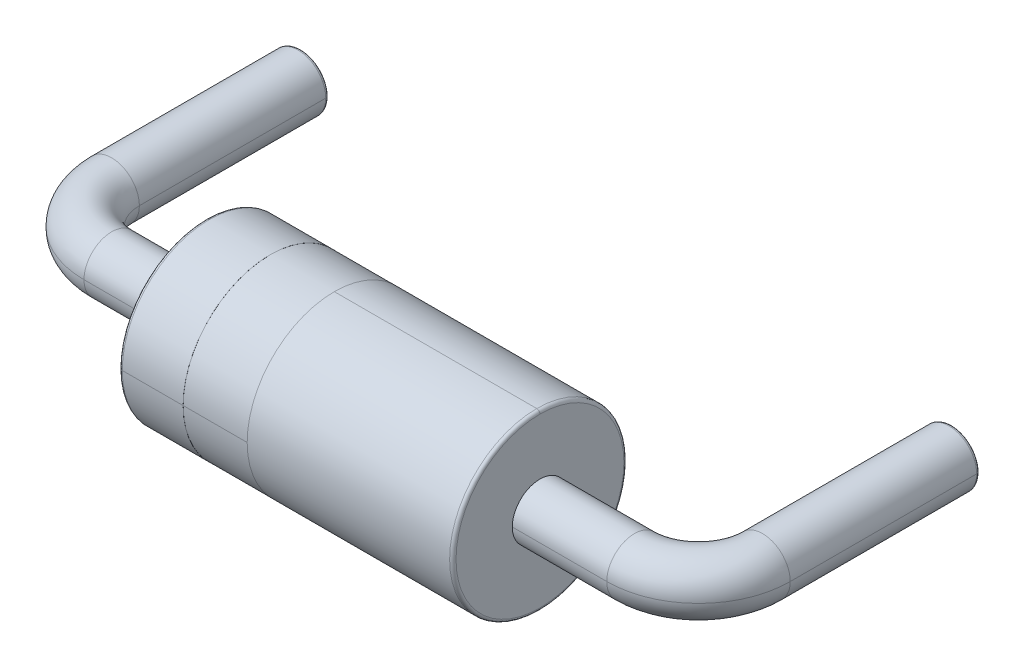
ISO-10303-21;
HEADER;
FILE_DESCRIPTION(('STEP AP214'),'2;1');
FILE_NAME('part.step','',(''),(''),'','','');
FILE_SCHEMA(('AUTOMOTIVE_DESIGN { 1 0 10303 214 1 1 1 1 }'));
ENDSEC;
DATA;
#1=APPLICATION_CONTEXT('core data for automotive mechanical design processes');
#2=APPLICATION_PROTOCOL_DEFINITION('international standard','automotive_design',2000,#1);
#3=PRODUCT_CONTEXT('',#1,'mechanical');
#4=PRODUCT('Part','Part','',(#3));
#5=PRODUCT_RELATED_PRODUCT_CATEGORY('part','',(#4));
#6=PRODUCT_DEFINITION_FORMATION('','',#4);
#7=PRODUCT_DEFINITION_CONTEXT('part definition',#1,'design');
#8=PRODUCT_DEFINITION('design','',#6,#7);
#9=PRODUCT_DEFINITION_SHAPE('','',#8);
#10=(LENGTH_UNIT() NAMED_UNIT(*) SI_UNIT(.MILLI.,.METRE.));
#11=(NAMED_UNIT(*) PLANE_ANGLE_UNIT() SI_UNIT($,.RADIAN.));
#12=(NAMED_UNIT(*) SI_UNIT($,.STERADIAN.) SOLID_ANGLE_UNIT());
#13=UNCERTAINTY_MEASURE_WITH_UNIT(LENGTH_MEASURE(1.E-05),#10,'distance_accuracy_value','');
#14=(GEOMETRIC_REPRESENTATION_CONTEXT(3) GLOBAL_UNCERTAINTY_ASSIGNED_CONTEXT((#13)) GLOBAL_UNIT_ASSIGNED_CONTEXT((#10,
#11,#12)) REPRESENTATION_CONTEXT('',''));
#15=CARTESIAN_POINT('',(0.,0.,0.));
#16=DIRECTION('',(0.,0.,1.));
#17=DIRECTION('',(1.,0.,0.));
#18=AXIS2_PLACEMENT_3D('',#15,#16,#17);
#19=CARTESIAN_POINT('',(-4.07991872,8.12800000022435E-05,0.360000000000064));
#20=DIRECTION('',(0.,-1.,0.));
#21=DIRECTION('',(0.,0.,-1.));
#22=AXIS2_PLACEMENT_3D('',#19,#20,#21);
#23=TOROIDAL_SURFACE('',#22,1.,0.432000000000017);
#24=CARTESIAN_POINT('',(-4.07991871999999,8.12800000022435E-05,1.36000000000006));
#25=DIRECTION('',(-1.,0.,0.));
#26=DIRECTION('',(0.,0.,1.));
#27=AXIS2_PLACEMENT_3D('',#24,#25,#26);
#28=CIRCLE('',#27,0.432000000000017);
#29=CARTESIAN_POINT('',(-4.07991871999999,8.12800000022965E-05,0.928000000000046));
#30=VERTEX_POINT('',#29);
#31=CARTESIAN_POINT('',(-4.07991871999999,8.12800000022435E-05,1.79200000000008));
#32=VERTEX_POINT('',#31);
#33=EDGE_CURVE('E9',#30,#32,#28,.T.);
#34=ORIENTED_EDGE('',*,*,#33,.T.);
#35=CARTESIAN_POINT('',(-4.07991872,8.12800000022435E-05,0.360000000000064));
#36=DIRECTION('',(0.,-1.,0.));
#37=DIRECTION('',(0.,0.,-1.));
#38=AXIS2_PLACEMENT_3D('',#35,#36,#37);
#39=CIRCLE('',#38,1.43200000000002);
#40=CARTESIAN_POINT('',(-5.51191872000001,8.12800000025943E-05,0.36000000000007));
#41=VERTEX_POINT('',#40);
#42=EDGE_CURVE('E22',#32,#41,#39,.T.);
#43=ORIENTED_EDGE('',*,*,#42,.T.);
#44=CARTESIAN_POINT('',(-5.07991871999999,8.12800000024885E-05,0.36000000000007));
#45=DIRECTION('',(0.,0.,-1.));
#46=DIRECTION('',(-1.,0.,0.));
#47=AXIS2_PLACEMENT_3D('',#44,#45,#46);
#48=CIRCLE('',#47,0.432000000000017);
#49=CARTESIAN_POINT('',(-4.64791871999998,8.12800000024356E-05,0.36000000000007));
#50=VERTEX_POINT('',#49);
#51=EDGE_CURVE('E267',#50,#41,#48,.T.);
#52=ORIENTED_EDGE('',*,*,#51,.F.);
#53=CARTESIAN_POINT('',(-4.07991872,8.12800000022965E-05,0.360000000000064));
#54=DIRECTION('',(0.,-1.,0.));
#55=DIRECTION('',(0.,0.,-1.));
#56=AXIS2_PLACEMENT_3D('',#53,#54,#55);
#57=CIRCLE('',#56,0.567999999999983);
#58=EDGE_CURVE('E264',#30,#50,#57,.T.);
#59=ORIENTED_EDGE('',*,*,#58,.F.);
#60=EDGE_LOOP('',(#34,#43,#52,#59));
#61=FACE_BOUND('',#60,.T.);
#62=ADVANCED_FACE('F15',(#61),#23,.T.);
#63=CARTESIAN_POINT('',(4.08008128,8.12800000002449E-05,0.360000000000008));
#64=DIRECTION('',(0.,-1.,0.));
#65=DIRECTION('',(0.,0.,-1.));
#66=AXIS2_PLACEMENT_3D('',#63,#64,#65);
#67=TOROIDAL_SURFACE('',#66,0.999999999999999,0.432000000000017);
#68=CARTESIAN_POINT('',(5.08008128,8.128E-05,0.360000000000001));
#69=DIRECTION('',(0.,0.,1.));
#70=DIRECTION('',(1.,0.,0.));
#71=AXIS2_PLACEMENT_3D('',#68,#69,#70);
#72=CIRCLE('',#71,0.432000000000017);
#73=CARTESIAN_POINT('',(4.64808127999999,8.12800000001058E-05,0.360000000000001));
#74=VERTEX_POINT('',#73);
#75=CARTESIAN_POINT('',(5.51208128000002,8.12799999999471E-05,0.360000000000001));
#76=VERTEX_POINT('',#75);
#77=EDGE_CURVE('E262',#74,#76,#72,.T.);
#78=ORIENTED_EDGE('',*,*,#77,.T.);
#79=CARTESIAN_POINT('',(4.08008128,8.12800000002449E-05,0.360000000000008));
#80=DIRECTION('',(0.,-1.,0.));
#81=DIRECTION('',(0.,0.,-1.));
#82=AXIS2_PLACEMENT_3D('',#79,#80,#81);
#83=CIRCLE('',#82,1.43200000000002);
#84=CARTESIAN_POINT('',(4.08008128000001,8.12800000002449E-05,1.79200000000002));
#85=VERTEX_POINT('',#84);
#86=EDGE_CURVE('E260',#76,#85,#83,.T.);
#87=ORIENTED_EDGE('',*,*,#86,.T.);
#88=CARTESIAN_POINT('',(4.08008128000001,8.12800000002449E-05,1.36000000000001));
#89=DIRECTION('',(-1.,0.,0.));
#90=DIRECTION('',(0.,0.,1.));
#91=AXIS2_PLACEMENT_3D('',#88,#89,#90);
#92=CIRCLE('',#91,0.432000000000017);
#93=CARTESIAN_POINT('',(4.08008128000001,8.12800000002978E-05,0.927999999999989));
#94=VERTEX_POINT('',#93);
#95=EDGE_CURVE('E257',#94,#85,#92,.T.);
#96=ORIENTED_EDGE('',*,*,#95,.F.);
#97=CARTESIAN_POINT('',(4.08008128,8.12800000002978E-05,0.360000000000008));
#98=DIRECTION('',(0.,-1.,0.));
#99=DIRECTION('',(0.,0.,-1.));
#100=AXIS2_PLACEMENT_3D('',#97,#98,#99);
#101=CIRCLE('',#100,0.567999999999982);
#102=EDGE_CURVE('E254',#74,#94,#101,.T.);
#103=ORIENTED_EDGE('',*,*,#102,.F.);
#104=EDGE_LOOP('',(#78,#87,#96,#103));
#105=FACE_BOUND('',#104,.T.);
#106=ADVANCED_FACE('F351',(#105),#67,.T.);
#107=CARTESIAN_POINT('',(-2.55491872,8.128000000187E-05,1.36000000000001));
#108=DIRECTION('',(1.,0.,0.));
#109=DIRECTION('',(0.,0.,-1.));
#110=AXIS2_PLACEMENT_3D('',#107,#108,#109);
#111=TOROIDAL_SURFACE('',#110,1.31,0.05);
#112=CARTESIAN_POINT('',(-2.60491872,8.12800000018823E-05,1.36000000000001));
#113=DIRECTION('',(-1.,0.,0.));
#114=DIRECTION('',(0.,0.,-1.));
#115=AXIS2_PLACEMENT_3D('',#112,#113,#114);
#116=CIRCLE('',#115,1.31);
#117=CARTESIAN_POINT('',(-2.60491872,8.12800000020458E-05,2.67000000000001));
#118=VERTEX_POINT('',#117);
#119=CARTESIAN_POINT('',(-2.60491872,8.12800000018823E-05,0.0500000000000069));
#120=VERTEX_POINT('',#119);
#121=EDGE_CURVE('E252',#118,#120,#116,.T.);
#122=ORIENTED_EDGE('',*,*,#121,.F.);
#123=CARTESIAN_POINT('',(-2.55491872,8.12800000020305E-05,2.67000000000001));
#124=DIRECTION('',(0.,1.,0.));
#125=DIRECTION('',(0.,0.,1.));
#126=AXIS2_PLACEMENT_3D('',#123,#124,#125);
#127=CIRCLE('',#126,0.0500000000000001);
#128=CARTESIAN_POINT('',(-2.55491872,8.128000000187E-05,2.72000000000001));
#129=VERTEX_POINT('',#128);
#130=EDGE_CURVE('E249',#118,#129,#127,.T.);
#131=ORIENTED_EDGE('',*,*,#130,.T.);
#132=CARTESIAN_POINT('',(-2.55491872,8.128000000187E-05,1.36000000000001));
#133=DIRECTION('',(1.,0.,0.));
#134=DIRECTION('',(0.,0.,-1.));
#135=AXIS2_PLACEMENT_3D('',#132,#133,#134);
#136=CIRCLE('',#135,1.36);
#137=CARTESIAN_POINT('',(-2.55491872,8.12800000020366E-05,0.));
#138=VERTEX_POINT('',#137);
#139=EDGE_CURVE('E246',#138,#129,#136,.T.);
#140=ORIENTED_EDGE('',*,*,#139,.F.);
#141=CARTESIAN_POINT('',(-2.55491872,8.128000000187E-05,0.0500000000000069));
#142=DIRECTION('',(0.,-1.,0.));
#143=DIRECTION('',(0.,0.,-1.));
#144=AXIS2_PLACEMENT_3D('',#141,#142,#143);
#145=CIRCLE('',#144,0.05);
#146=EDGE_CURVE('E243',#120,#138,#145,.T.);
#147=ORIENTED_EDGE('',*,*,#146,.F.);
#148=EDGE_LOOP('',(#122,#131,#140,#147));
#149=FACE_BOUND('',#148,.T.);
#150=ADVANCED_FACE('F355',(#149),#111,.T.);
#151=CARTESIAN_POINT('',(2.55508128,8.12800000005605E-05,1.36000000000001));
#152=DIRECTION('',(1.,0.,0.));
#153=DIRECTION('',(0.,1.,0.));
#154=AXIS2_PLACEMENT_3D('',#151,#152,#153);
#155=TOROIDAL_SURFACE('',#154,1.31,0.05);
#156=CARTESIAN_POINT('',(2.55508128,8.12800000005605E-05,1.36000000000001));
#157=DIRECTION('',(-1.,0.,0.));
#158=DIRECTION('',(0.,1.,0.));
#159=AXIS2_PLACEMENT_3D('',#156,#157,#158);
#160=CIRCLE('',#159,1.36);
#161=CARTESIAN_POINT('',(2.55508128,-1.35991872,1.36000000000001));
#162=VERTEX_POINT('',#161);
#163=CARTESIAN_POINT('',(2.55508128,1.36008128,1.36000000000001));
#164=VERTEX_POINT('',#163);
#165=EDGE_CURVE('E144',#162,#164,#160,.T.);
#166=ORIENTED_EDGE('',*,*,#165,.F.);
#167=CARTESIAN_POINT('',(2.55508128,-1.30991872,1.36000000000001));
#168=DIRECTION('',(0.,0.,1.));
#169=DIRECTION('',(0.,-1.,0.));
#170=AXIS2_PLACEMENT_3D('',#167,#168,#169);
#171=CIRCLE('',#170,0.0499999999999999);
#172=CARTESIAN_POINT('',(2.60508128,-1.30991872,1.36000000000001));
#173=VERTEX_POINT('',#172);
#174=EDGE_CURVE('E240',#162,#173,#171,.T.);
#175=ORIENTED_EDGE('',*,*,#174,.T.);
#176=CARTESIAN_POINT('',(2.60508128,8.12800000005545E-05,1.36000000000001));
#177=DIRECTION('',(1.,0.,0.));
#178=DIRECTION('',(0.,1.,0.));
#179=AXIS2_PLACEMENT_3D('',#176,#177,#178);
#180=CIRCLE('',#179,1.31);
#181=CARTESIAN_POINT('',(2.60508128,1.31008128,1.36000000000001));
#182=VERTEX_POINT('',#181);
#183=EDGE_CURVE('E237',#182,#173,#180,.T.);
#184=ORIENTED_EDGE('',*,*,#183,.F.);
#185=CARTESIAN_POINT('',(2.55508128,1.31008128,1.36000000000001));
#186=DIRECTION('',(0.,0.,-1.));
#187=DIRECTION('',(-1.,0.,0.));
#188=AXIS2_PLACEMENT_3D('',#185,#186,#187);
#189=CIRCLE('',#188,0.0500000000000001);
#190=EDGE_CURVE('E235',#164,#182,#189,.T.);
#191=ORIENTED_EDGE('',*,*,#190,.F.);
#192=EDGE_LOOP('',(#166,#175,#184,#191));
#193=FACE_BOUND('',#192,.T.);
#194=ADVANCED_FACE('F360',(#193),#155,.T.);
#195=CARTESIAN_POINT('',(-5.07991872000002,8.12800000024885E-05,-2.54999999999993));
#196=DIRECTION('',(0.,0.,-1.));
#197=DIRECTION('',(-1.,0.,0.));
#198=AXIS2_PLACEMENT_3D('',#195,#196,#197);
#199=TOROIDAL_SURFACE('',#198,0.382000000000017,0.05);
#200=CARTESIAN_POINT('',(-5.07991872000002,8.12800000024885E-05,-2.54999999999993));
#201=DIRECTION('',(0.,0.,1.));
#202=DIRECTION('',(-1.,0.,0.));
#203=AXIS2_PLACEMENT_3D('',#200,#201,#202);
#204=CIRCLE('',#203,0.432000000000017);
#205=CARTESIAN_POINT('',(-4.64791872,8.12800000024356E-05,-2.54999999999993));
#206=VERTEX_POINT('',#205);
#207=CARTESIAN_POINT('',(-5.51191872000003,8.12800000025943E-05,-2.54999999999993));
#208=VERTEX_POINT('',#207);
#209=EDGE_CURVE('E233',#206,#208,#204,.T.);
#210=ORIENTED_EDGE('',*,*,#209,.F.);
#211=CARTESIAN_POINT('',(-4.69791872,8.12800000024417E-05,-2.54999999999993));
#212=DIRECTION('',(0.,1.,0.));
#213=DIRECTION('',(-1.,0.,0.));
#214=AXIS2_PLACEMENT_3D('',#211,#212,#213);
#215=CIRCLE('',#214,0.0499999999999997);
#216=CARTESIAN_POINT('',(-4.69791872,8.12800000024448E-05,-2.59999999999993));
#217=VERTEX_POINT('',#216);
#218=EDGE_CURVE('E231',#206,#217,#215,.T.);
#219=ORIENTED_EDGE('',*,*,#218,.T.);
#220=CARTESIAN_POINT('',(-5.07991872000002,8.12800000024885E-05,-2.59999999999993));
#221=DIRECTION('',(0.,0.,-1.));
#222=DIRECTION('',(-1.,0.,0.));
#223=AXIS2_PLACEMENT_3D('',#220,#221,#222);
#224=CIRCLE('',#223,0.382000000000018);
#225=CARTESIAN_POINT('',(-5.46191872000003,8.1280000002582E-05,-2.59999999999993));
#226=VERTEX_POINT('',#225);
#227=EDGE_CURVE('E228',#226,#217,#224,.T.);
#228=ORIENTED_EDGE('',*,*,#227,.F.);
#229=CARTESIAN_POINT('',(-5.46191872000003,8.1280000002582E-05,-2.54999999999993));
#230=DIRECTION('',(0.,-1.,0.));
#231=DIRECTION('',(0.,0.,-1.));
#232=AXIS2_PLACEMENT_3D('',#229,#230,#231);
#233=CIRCLE('',#232,0.0500000000000001);
#234=EDGE_CURVE('E225',#208,#226,#233,.T.);
#235=ORIENTED_EDGE('',*,*,#234,.F.);
#236=EDGE_LOOP('',(#210,#219,#228,#235));
#237=FACE_BOUND('',#236,.T.);
#238=ADVANCED_FACE('F284',(#237),#199,.T.);
#239=CARTESIAN_POINT('',(5.08008127999998,8.128E-05,-2.55));
#240=DIRECTION('',(0.,0.,1.));
#241=DIRECTION('',(1.,0.,0.));
#242=AXIS2_PLACEMENT_3D('',#239,#240,#241);
#243=TOROIDAL_SURFACE('',#242,0.382000000000017,0.05);
#244=CARTESIAN_POINT('',(5.08008127999998,8.128E-05,-2.6));
#245=DIRECTION('',(0.,0.,-1.));
#246=DIRECTION('',(1.,0.,0.));
#247=AXIS2_PLACEMENT_3D('',#244,#245,#246);
#248=CIRCLE('',#247,0.382000000000017);
#249=CARTESIAN_POINT('',(4.69808127999996,8.12800000001434E-05,-2.6));
#250=VERTEX_POINT('',#249);
#251=CARTESIAN_POINT('',(5.46208128,8.12799999999064E-05,-2.6));
#252=VERTEX_POINT('',#251);
#253=EDGE_CURVE('E222',#250,#252,#248,.T.);
#254=ORIENTED_EDGE('',*,*,#253,.F.);
#255=CARTESIAN_POINT('',(4.69808127999996,8.12800000001403E-05,-2.55));
#256=DIRECTION('',(0.,1.,0.));
#257=DIRECTION('',(-1.,0.,0.));
#258=AXIS2_PLACEMENT_3D('',#255,#256,#257);
#259=CIRCLE('',#258,0.05);
#260=CARTESIAN_POINT('',(4.64808127999996,8.12800000001058E-05,-2.55));
#261=VERTEX_POINT('',#260);
#262=EDGE_CURVE('E220',#250,#261,#259,.T.);
#263=ORIENTED_EDGE('',*,*,#262,.T.);
#264=CARTESIAN_POINT('',(5.08008127999998,8.128E-05,-2.55));
#265=DIRECTION('',(0.,0.,1.));
#266=DIRECTION('',(1.,0.,0.));
#267=AXIS2_PLACEMENT_3D('',#264,#265,#266);
#268=CIRCLE('',#267,0.432000000000017);
#269=CARTESIAN_POINT('',(5.51208128,8.12799999999471E-05,-2.55));
#270=VERTEX_POINT('',#269);
#271=EDGE_CURVE('E217',#270,#261,#268,.T.);
#272=ORIENTED_EDGE('',*,*,#271,.F.);
#273=CARTESIAN_POINT('',(5.46208128,8.12799999999064E-05,-2.55));
#274=DIRECTION('',(0.,-1.,0.));
#275=DIRECTION('',(0.,0.,-1.));
#276=AXIS2_PLACEMENT_3D('',#273,#274,#275);
#277=CIRCLE('',#276,0.0500000000000001);
#278=EDGE_CURVE('E215',#252,#270,#277,.T.);
#279=ORIENTED_EDGE('',*,*,#278,.F.);
#280=EDGE_LOOP('',(#254,#263,#272,#279));
#281=FACE_BOUND('',#280,.T.);
#282=ADVANCED_FACE('F369',(#281),#243,.T.);
#283=CARTESIAN_POINT('',(4.08008128000001,8.12800000002449E-05,1.36000000000001));
#284=DIRECTION('',(-1.,0.,0.));
#285=DIRECTION('',(0.,0.,1.));
#286=AXIS2_PLACEMENT_3D('',#283,#284,#285);
#287=CYLINDRICAL_SURFACE('',#286,0.432000000000017);
#288=CARTESIAN_POINT('',(-2.60491872,8.12800000018823E-05,1.36000000000001));
#289=DIRECTION('',(-1.,0.,0.));
#290=DIRECTION('',(0.,0.,1.));
#291=AXIS2_PLACEMENT_3D('',#288,#289,#290);
#292=CIRCLE('',#291,0.432000000000017);
#293=CARTESIAN_POINT('',(-2.60491872,8.12800000018823E-05,1.79200000000002));
#294=VERTEX_POINT('',#293);
#295=CARTESIAN_POINT('',(-2.60491872,8.12800000019352E-05,0.92799999999999));
#296=VERTEX_POINT('',#295);
#297=EDGE_CURVE('E213',#294,#296,#292,.T.);
#298=ORIENTED_EDGE('',*,*,#297,.T.);
#299=DIRECTION('',(-1.,0.,0.));
#300=VECTOR('',#299,1.);
#301=CARTESIAN_POINT('',(4.08008128000001,8.12800000002978E-05,0.927999999999989));
#302=LINE('',#301,#300);
#303=EDGE_CURVE('E211',#296,#30,#302,.T.);
#304=ORIENTED_EDGE('',*,*,#303,.T.);
#305=CARTESIAN_POINT('',(-4.07991871999999,8.12800000022435E-05,1.36000000000006));
#306=DIRECTION('',(-1.,0.,0.));
#307=DIRECTION('',(0.,0.,1.));
#308=AXIS2_PLACEMENT_3D('',#305,#306,#307);
#309=CIRCLE('',#308,0.432000000000017);
#310=EDGE_CURVE('E208',#32,#30,#309,.T.);
#311=ORIENTED_EDGE('',*,*,#310,.F.);
#312=DIRECTION('',(-1.,0.,0.));
#313=VECTOR('',#312,1.);
#314=CARTESIAN_POINT('',(4.08008128000001,8.12800000002449E-05,1.79200000000002));
#315=LINE('',#314,#313);
#316=EDGE_CURVE('E206',#294,#32,#315,.T.);
#317=ORIENTED_EDGE('',*,*,#316,.F.);
#318=EDGE_LOOP('',(#298,#304,#311,#317));
#319=FACE_BOUND('',#318,.T.);
#320=ADVANCED_FACE('F372',(#319),#287,.T.);
#321=CARTESIAN_POINT('',(-5.07991871999999,8.12800000024885E-05,0.36000000000007));
#322=DIRECTION('',(0.,0.,-1.));
#323=DIRECTION('',(-1.,0.,0.));
#324=AXIS2_PLACEMENT_3D('',#321,#322,#323);
#325=CYLINDRICAL_SURFACE('',#324,0.432000000000017);
#326=CARTESIAN_POINT('',(-5.07991871999999,8.12800000024885E-05,0.36000000000007));
#327=DIRECTION('',(0.,0.,-1.));
#328=DIRECTION('',(-1.,0.,0.));
#329=AXIS2_PLACEMENT_3D('',#326,#327,#328);
#330=CIRCLE('',#329,0.432000000000017);
#331=EDGE_CURVE('E203',#41,#50,#330,.T.);
#332=ORIENTED_EDGE('',*,*,#331,.T.);
#333=DIRECTION('',(0.,0.,-1.));
#334=VECTOR('',#333,1.);
#335=CARTESIAN_POINT('',(-4.64791871999998,8.12800000024356E-05,0.360000000000067));
#336=LINE('',#335,#334);
#337=EDGE_CURVE('E200',#50,#206,#336,.T.);
#338=ORIENTED_EDGE('',*,*,#337,.T.);
#339=ORIENTED_EDGE('',*,*,#209,.T.);
#340=DIRECTION('',(0.,0.,-1.));
#341=VECTOR('',#340,1.);
#342=CARTESIAN_POINT('',(-5.51191872000001,8.12800000025943E-05,0.360000000000073));
#343=LINE('',#342,#341);
#344=EDGE_CURVE('E197',#41,#208,#343,.T.);
#345=ORIENTED_EDGE('',*,*,#344,.F.);
#346=EDGE_LOOP('',(#332,#338,#339,#345));
#347=FACE_BOUND('',#346,.T.);
#348=ADVANCED_FACE('F280',(#347),#325,.T.);
#349=CARTESIAN_POINT('',(6.97968511534427,8.12799999995347E-05,1.36000000000001));
#350=DIRECTION('',(-1.,0.,0.));
#351=DIRECTION('',(0.,0.,1.));
#352=AXIS2_PLACEMENT_3D('',#349,#350,#351);
#353=CYLINDRICAL_SURFACE('',#352,1.36);
#354=CARTESIAN_POINT('',(-1.60491872,8.12800000016373E-05,1.36000000000001));
#355=DIRECTION('',(-1.,0.,0.));
#356=DIRECTION('',(0.,0.,1.));
#357=AXIS2_PLACEMENT_3D('',#354,#355,#356);
#358=CIRCLE('',#357,1.36);
#359=CARTESIAN_POINT('',(-1.60491872,8.12800000016373E-05,2.72000000000001));
#360=VERTEX_POINT('',#359);
#361=CARTESIAN_POINT('',(-1.60491872,8.12800000018039E-05,0.));
#362=VERTEX_POINT('',#361);
#363=EDGE_CURVE('E195',#360,#362,#358,.T.);
#364=ORIENTED_EDGE('',*,*,#363,.T.);
#365=DIRECTION('',(-1.,0.,0.));
#366=VECTOR('',#365,1.);
#367=CARTESIAN_POINT('',(6.97968511534427,8.12799999997013E-05,0.));
#368=LINE('',#367,#366);
#369=EDGE_CURVE('E193',#362,#138,#368,.T.);
#370=ORIENTED_EDGE('',*,*,#369,.T.);
#371=ORIENTED_EDGE('',*,*,#139,.T.);
#372=DIRECTION('',(-1.,0.,0.));
#373=VECTOR('',#372,1.);
#374=CARTESIAN_POINT('',(6.97968511534427,8.12799999995347E-05,2.72000000000001));
#375=LINE('',#374,#373);
#376=EDGE_CURVE('E191',#360,#129,#375,.T.);
#377=ORIENTED_EDGE('',*,*,#376,.F.);
#378=EDGE_LOOP('',(#364,#370,#371,#377));
#379=FACE_BOUND('',#378,.T.);
#380=ADVANCED_FACE('F379',(#379),#353,.T.);
#381=CARTESIAN_POINT('',(7.56551573386673,8.12799999993913E-05,1.36000000000001));
#382=DIRECTION('',(-1.,0.,0.));
#383=DIRECTION('',(0.,0.,1.));
#384=AXIS2_PLACEMENT_3D('',#381,#382,#383);
#385=CYLINDRICAL_SURFACE('',#384,1.359);
#386=CARTESIAN_POINT('',(-0.60491872,8.12800000013924E-05,1.36000000000001));
#387=DIRECTION('',(-1.,0.,0.));
#388=DIRECTION('',(0.,0.,1.));
#389=AXIS2_PLACEMENT_3D('',#386,#387,#388);
#390=CIRCLE('',#389,1.359);
#391=CARTESIAN_POINT('',(-0.60491872,8.12800000013924E-05,2.71900000000001));
#392=VERTEX_POINT('',#391);
#393=CARTESIAN_POINT('',(-0.60491872,8.12800000015588E-05,0.00100000000000707));
#394=VERTEX_POINT('',#393);
#395=EDGE_CURVE('E189',#392,#394,#390,.T.);
#396=ORIENTED_EDGE('',*,*,#395,.T.);
#397=DIRECTION('',(-1.,0.,0.));
#398=VECTOR('',#397,1.);
#399=CARTESIAN_POINT('',(7.56551573386673,8.12799999995577E-05,0.00100000000000707));
#400=LINE('',#399,#398);
#401=CARTESIAN_POINT('',(-1.60491872,8.12800000018038E-05,0.00100000000000707));
#402=VERTEX_POINT('',#401);
#403=EDGE_CURVE('E187',#394,#402,#400,.T.);
#404=ORIENTED_EDGE('',*,*,#403,.T.);
#405=CARTESIAN_POINT('',(-1.60491872,8.12800000016373E-05,1.36000000000001));
#406=DIRECTION('',(-1.,0.,0.));
#407=DIRECTION('',(0.,0.,1.));
#408=AXIS2_PLACEMENT_3D('',#405,#406,#407);
#409=CIRCLE('',#408,1.359);
#410=CARTESIAN_POINT('',(-1.60491872,8.12800000016373E-05,2.71900000000001));
#411=VERTEX_POINT('',#410);
#412=EDGE_CURVE('E184',#411,#402,#409,.T.);
#413=ORIENTED_EDGE('',*,*,#412,.F.);
#414=DIRECTION('',(-1.,0.,0.));
#415=VECTOR('',#414,1.);
#416=CARTESIAN_POINT('',(7.56551573386673,8.12799999993913E-05,2.71900000000001));
#417=LINE('',#416,#415);
#418=EDGE_CURVE('E181',#392,#411,#417,.T.);
#419=ORIENTED_EDGE('',*,*,#418,.F.);
#420=EDGE_LOOP('',(#396,#404,#413,#419));
#421=FACE_BOUND('',#420,.T.);
#422=ADVANCED_FACE('F333',(#421),#385,.T.);
#423=CARTESIAN_POINT('',(4.08008128000001,8.12800000002449E-05,1.36000000000001));
#424=DIRECTION('',(-1.,0.,0.));
#425=DIRECTION('',(0.,0.,1.));
#426=AXIS2_PLACEMENT_3D('',#423,#424,#425);
#427=CYLINDRICAL_SURFACE('',#426,0.432000000000017);
#428=CARTESIAN_POINT('',(4.08008128000001,8.12800000002449E-05,1.36000000000001));
#429=DIRECTION('',(-1.,0.,0.));
#430=DIRECTION('',(0.,0.,1.));
#431=AXIS2_PLACEMENT_3D('',#428,#429,#430);
#432=CIRCLE('',#431,0.432000000000017);
#433=EDGE_CURVE('E178',#85,#94,#432,.T.);
#434=ORIENTED_EDGE('',*,*,#433,.T.);
#435=DIRECTION('',(-1.,0.,0.));
#436=VECTOR('',#435,1.);
#437=CARTESIAN_POINT('',(4.08008128000001,8.12800000002978E-05,0.927999999999989));
#438=LINE('',#437,#436);
#439=CARTESIAN_POINT('',(2.60508128,8.12800000006591E-05,0.928));
#440=VERTEX_POINT('',#439);
#441=EDGE_CURVE('E176',#94,#440,#438,.T.);
#442=ORIENTED_EDGE('',*,*,#441,.T.);
#443=CARTESIAN_POINT('',(2.60508128,8.12800000006062E-05,1.36000000000002));
#444=DIRECTION('',(-1.,0.,0.));
#445=DIRECTION('',(0.,1.,0.));
#446=AXIS2_PLACEMENT_3D('',#443,#444,#445);
#447=CIRCLE('',#446,0.432000000000017);
#448=CARTESIAN_POINT('',(2.60508128,8.12800000006062E-05,1.79200000000003));
#449=VERTEX_POINT('',#448);
#450=EDGE_CURVE('E173',#449,#440,#447,.T.);
#451=ORIENTED_EDGE('',*,*,#450,.F.);
#452=DIRECTION('',(-1.,0.,0.));
#453=VECTOR('',#452,1.);
#454=CARTESIAN_POINT('',(4.08008128000001,8.12800000002449E-05,1.79200000000002));
#455=LINE('',#454,#453);
#456=EDGE_CURVE('E170',#85,#449,#455,.T.);
#457=ORIENTED_EDGE('',*,*,#456,.F.);
#458=EDGE_LOOP('',(#434,#442,#451,#457));
#459=FACE_BOUND('',#458,.T.);
#460=ADVANCED_FACE('F385',(#459),#427,.T.);
#461=CARTESIAN_POINT('',(5.08008128,8.128E-05,0.360000000000001));
#462=DIRECTION('',(0.,0.,-1.));
#463=DIRECTION('',(-1.,0.,0.));
#464=AXIS2_PLACEMENT_3D('',#461,#462,#463);
#465=CYLINDRICAL_SURFACE('',#464,0.432000000000017);
#466=CARTESIAN_POINT('',(5.08008128,8.128E-05,0.360000000000001));
#467=DIRECTION('',(0.,0.,1.));
#468=DIRECTION('',(1.,0.,0.));
#469=AXIS2_PLACEMENT_3D('',#466,#467,#468);
#470=CIRCLE('',#469,0.432000000000017);
#471=EDGE_CURVE('E167',#76,#74,#470,.T.);
#472=ORIENTED_EDGE('',*,*,#471,.F.);
#473=DIRECTION('',(0.,0.,-1.));
#474=VECTOR('',#473,1.);
#475=CARTESIAN_POINT('',(5.51208128000002,8.12799999999471E-05,0.359999999999998));
#476=LINE('',#475,#474);
#477=EDGE_CURVE('E161',#76,#270,#476,.T.);
#478=ORIENTED_EDGE('',*,*,#477,.T.);
#479=ORIENTED_EDGE('',*,*,#271,.T.);
#480=DIRECTION('',(0.,0.,-1.));
#481=VECTOR('',#480,1.);
#482=CARTESIAN_POINT('',(4.64808127999999,8.12800000001058E-05,0.360000000000004));
#483=LINE('',#482,#481);
#484=EDGE_CURVE('E158',#74,#261,#483,.T.);
#485=ORIENTED_EDGE('',*,*,#484,.F.);
#486=EDGE_LOOP('',(#472,#478,#479,#485));
#487=FACE_BOUND('',#486,.T.);
#488=ADVANCED_FACE('F388',(#487),#465,.T.);
#489=CARTESIAN_POINT('',(3.01858417097308,8.12800000005049E-05,1.36000000000001));
#490=DIRECTION('',(1.,0.,0.));
#491=DIRECTION('',(0.,1.,0.));
#492=AXIS2_PLACEMENT_3D('',#489,#490,#491);
#493=CYLINDRICAL_SURFACE('',#492,1.36);
#494=CARTESIAN_POINT('',(-0.60491872,8.12800000009395E-05,1.36000000000001));
#495=DIRECTION('',(1.,0.,0.));
#496=DIRECTION('',(0.,1.,0.));
#497=AXIS2_PLACEMENT_3D('',#494,#495,#496);
#498=CIRCLE('',#497,1.36);
#499=CARTESIAN_POINT('',(-0.60491872,1.36008128,1.36000000000001));
#500=VERTEX_POINT('',#499);
#501=CARTESIAN_POINT('',(-0.60491872,-1.35991872,1.36000000000001));
#502=VERTEX_POINT('',#501);
#503=EDGE_CURVE('E142',#500,#502,#498,.T.);
#504=ORIENTED_EDGE('',*,*,#503,.T.);
#505=DIRECTION('',(1.,0.,0.));
#506=VECTOR('',#505,1.);
#507=CARTESIAN_POINT('',(3.01858417097308,-1.35991872,1.36000000000001));
#508=LINE('',#507,#506);
#509=EDGE_CURVE('E148',#502,#162,#508,.T.);
#510=ORIENTED_EDGE('',*,*,#509,.T.);
#511=ORIENTED_EDGE('',*,*,#165,.T.);
#512=DIRECTION('',(1.,0.,0.));
#513=VECTOR('',#512,1.);
#514=CARTESIAN_POINT('',(3.01858417097308,1.36008128,1.36000000000001));
#515=LINE('',#514,#513);
#516=EDGE_CURVE('E138',#500,#164,#515,.T.);
#517=ORIENTED_EDGE('',*,*,#516,.F.);
#518=EDGE_LOOP('',(#504,#510,#511,#517));
#519=FACE_BOUND('',#518,.T.);
#520=ADVANCED_FACE('F140',(#519),#493,.T.);
#521=CARTESIAN_POINT('',(-0.60491872,0.432081280000019,1.36000000000001));
#522=DIRECTION('',(-1.,0.,0.));
#523=DIRECTION('',(0.,-1.,0.));
#524=AXIS2_PLACEMENT_3D('',#521,#522,#523);
#525=PLANE('',#524);
#526=ORIENTED_EDGE('',*,*,#503,.F.);
#527=CARTESIAN_POINT('',(-0.60491872,8.12800000009395E-05,1.36000000000001));
#528=DIRECTION('',(1.,0.,0.));
#529=DIRECTION('',(0.,1.,0.));
#530=AXIS2_PLACEMENT_3D('',#527,#528,#529);
#531=CIRCLE('',#530,1.36);
#532=EDGE_CURVE('E149',#502,#500,#531,.T.);
#533=ORIENTED_EDGE('',*,*,#532,.F.);
#534=EDGE_LOOP('',(#526,#533));
#535=FACE_BOUND('',#534,.T.);
#536=ORIENTED_EDGE('',*,*,#395,.F.);
#537=CARTESIAN_POINT('',(-0.60491872,8.12800000013924E-05,1.36000000000001));
#538=DIRECTION('',(-1.,0.,0.));
#539=DIRECTION('',(0.,0.,1.));
#540=AXIS2_PLACEMENT_3D('',#537,#538,#539);
#541=CIRCLE('',#540,1.359);
#542=EDGE_CURVE('E154',#394,#392,#541,.T.);
#543=ORIENTED_EDGE('',*,*,#542,.F.);
#544=EDGE_LOOP('',(#536,#543));
#545=FACE_BOUND('',#544,.T.);
#546=ADVANCED_FACE('F156',(#535,#545),#525,.T.);
#547=CARTESIAN_POINT('',(3.01858417097308,8.12800000005049E-05,1.36000000000001));
#548=DIRECTION('',(1.,0.,0.));
#549=DIRECTION('',(0.,1.,0.));
#550=AXIS2_PLACEMENT_3D('',#547,#548,#549);
#551=CYLINDRICAL_SURFACE('',#550,1.36);
#552=ORIENTED_EDGE('',*,*,#509,.F.);
#553=ORIENTED_EDGE('',*,*,#532,.T.);
#554=ORIENTED_EDGE('',*,*,#516,.T.);
#555=CARTESIAN_POINT('',(2.55508128,8.12800000005605E-05,1.36000000000001));
#556=DIRECTION('',(-1.,0.,0.));
#557=DIRECTION('',(0.,1.,0.));
#558=AXIS2_PLACEMENT_3D('',#555,#556,#557);
#559=CIRCLE('',#558,1.36);
#560=EDGE_CURVE('E323',#164,#162,#559,.T.);
#561=ORIENTED_EDGE('',*,*,#560,.T.);
#562=EDGE_LOOP('',(#552,#553,#554,#561));
#563=FACE_BOUND('',#562,.T.);
#564=ADVANCED_FACE('F152',(#563),#551,.T.);
#565=CARTESIAN_POINT('',(2.60508128,0.432081280000018,1.36000000000001));
#566=DIRECTION('',(1.,0.,0.));
#567=DIRECTION('',(0.,1.,0.));
#568=AXIS2_PLACEMENT_3D('',#565,#566,#567);
#569=PLANE('',#568);
#570=ORIENTED_EDGE('',*,*,#183,.T.);
#571=CARTESIAN_POINT('',(2.60508128,8.12800000005545E-05,1.36000000000001));
#572=DIRECTION('',(1.,0.,0.));
#573=DIRECTION('',(0.,1.,0.));
#574=AXIS2_PLACEMENT_3D('',#571,#572,#573);
#575=CIRCLE('',#574,1.31);
#576=EDGE_CURVE('E320',#173,#182,#575,.T.);
#577=ORIENTED_EDGE('',*,*,#576,.T.);
#578=EDGE_LOOP('',(#570,#577));
#579=FACE_BOUND('',#578,.T.);
#580=ORIENTED_EDGE('',*,*,#450,.T.);
#581=CARTESIAN_POINT('',(2.60508128,8.12800000006062E-05,1.36000000000002));
#582=DIRECTION('',(-1.,0.,0.));
#583=DIRECTION('',(0.,1.,0.));
#584=AXIS2_PLACEMENT_3D('',#581,#582,#583);
#585=CIRCLE('',#584,0.432000000000017);
#586=EDGE_CURVE('E317',#440,#449,#585,.T.);
#587=ORIENTED_EDGE('',*,*,#586,.T.);
#588=EDGE_LOOP('',(#580,#587));
#589=FACE_BOUND('',#588,.T.);
#590=ADVANCED_FACE('F399',(#579,#589),#569,.T.);
#591=CARTESIAN_POINT('',(5.08008127999998,8.128E-05,-2.6));
#592=DIRECTION('',(0.,0.,1.));
#593=DIRECTION('',(1.,0.,0.));
#594=AXIS2_PLACEMENT_3D('',#591,#592,#593);
#595=PLANE('',#594);
#596=CARTESIAN_POINT('',(5.08008127999998,8.128E-05,-2.6));
#597=DIRECTION('',(0.,0.,-1.));
#598=DIRECTION('',(1.,0.,0.));
#599=AXIS2_PLACEMENT_3D('',#596,#597,#598);
#600=CIRCLE('',#599,0.382000000000017);
#601=EDGE_CURVE('E314',#252,#250,#600,.T.);
#602=ORIENTED_EDGE('',*,*,#601,.T.);
#603=ORIENTED_EDGE('',*,*,#253,.T.);
#604=EDGE_LOOP('',(#602,#603));
#605=FACE_BOUND('',#604,.T.);
#606=ADVANCED_FACE('F402',(#605),#595,.F.);
#607=CARTESIAN_POINT('',(5.08008128,8.128E-05,0.360000000000001));
#608=DIRECTION('',(0.,0.,-1.));
#609=DIRECTION('',(-1.,0.,0.));
#610=AXIS2_PLACEMENT_3D('',#607,#608,#609);
#611=CYLINDRICAL_SURFACE('',#610,0.432000000000017);
#612=ORIENTED_EDGE('',*,*,#477,.F.);
#613=ORIENTED_EDGE('',*,*,#77,.F.);
#614=ORIENTED_EDGE('',*,*,#484,.T.);
#615=CARTESIAN_POINT('',(5.08008127999998,8.128E-05,-2.55));
#616=DIRECTION('',(0.,0.,1.));
#617=DIRECTION('',(1.,0.,0.));
#618=AXIS2_PLACEMENT_3D('',#615,#616,#617);
#619=CIRCLE('',#618,0.432000000000017);
#620=EDGE_CURVE('E311',#261,#270,#619,.T.);
#621=ORIENTED_EDGE('',*,*,#620,.T.);
#622=EDGE_LOOP('',(#612,#613,#614,#621));
#623=FACE_BOUND('',#622,.T.);
#624=ADVANCED_FACE('F406',(#623),#611,.T.);
#625=CARTESIAN_POINT('',(4.08008128,8.12800000002449E-05,0.360000000000008));
#626=DIRECTION('',(0.,-1.,0.));
#627=DIRECTION('',(0.,0.,-1.));
#628=AXIS2_PLACEMENT_3D('',#625,#626,#627);
#629=TOROIDAL_SURFACE('',#628,0.999999999999999,0.432000000000017);
#630=ORIENTED_EDGE('',*,*,#86,.F.);
#631=ORIENTED_EDGE('',*,*,#471,.T.);
#632=ORIENTED_EDGE('',*,*,#102,.T.);
#633=ORIENTED_EDGE('',*,*,#433,.F.);
#634=EDGE_LOOP('',(#630,#631,#632,#633));
#635=FACE_BOUND('',#634,.T.);
#636=ADVANCED_FACE('F410',(#635),#629,.T.);
#637=CARTESIAN_POINT('',(4.08008128000001,8.12800000002449E-05,1.36000000000001));
#638=DIRECTION('',(-1.,0.,0.));
#639=DIRECTION('',(0.,0.,1.));
#640=AXIS2_PLACEMENT_3D('',#637,#638,#639);
#641=CYLINDRICAL_SURFACE('',#640,0.432000000000017);
#642=ORIENTED_EDGE('',*,*,#441,.F.);
#643=ORIENTED_EDGE('',*,*,#95,.T.);
#644=ORIENTED_EDGE('',*,*,#456,.T.);
#645=ORIENTED_EDGE('',*,*,#586,.F.);
#646=EDGE_LOOP('',(#642,#643,#644,#645));
#647=FACE_BOUND('',#646,.T.);
#648=ADVANCED_FACE('F348',(#647),#641,.T.);
#649=CARTESIAN_POINT('',(7.56551573386673,8.12799999993913E-05,1.36000000000001));
#650=DIRECTION('',(-1.,0.,0.));
#651=DIRECTION('',(0.,0.,1.));
#652=AXIS2_PLACEMENT_3D('',#649,#650,#651);
#653=CYLINDRICAL_SURFACE('',#652,1.359);
#654=ORIENTED_EDGE('',*,*,#403,.F.);
#655=ORIENTED_EDGE('',*,*,#542,.T.);
#656=ORIENTED_EDGE('',*,*,#418,.T.);
#657=CARTESIAN_POINT('',(-1.60491872,8.12800000016373E-05,1.36000000000001));
#658=DIRECTION('',(-1.,0.,0.));
#659=DIRECTION('',(0.,0.,1.));
#660=AXIS2_PLACEMENT_3D('',#657,#658,#659);
#661=CIRCLE('',#660,1.359);
#662=EDGE_CURVE('E308',#402,#411,#661,.T.);
#663=ORIENTED_EDGE('',*,*,#662,.F.);
#664=EDGE_LOOP('',(#654,#655,#656,#663));
#665=FACE_BOUND('',#664,.T.);
#666=ADVANCED_FACE('F329',(#665),#653,.T.);
#667=CARTESIAN_POINT('',(-1.60491872,0.432081280000019,1.36000000000001));
#668=DIRECTION('',(-1.,0.,0.));
#669=DIRECTION('',(0.,0.,1.));
#670=AXIS2_PLACEMENT_3D('',#667,#668,#669);
#671=PLANE('',#670);
#672=ORIENTED_EDGE('',*,*,#363,.F.);
#673=CARTESIAN_POINT('',(-1.60491872,8.12800000016373E-05,1.36000000000001));
#674=DIRECTION('',(-1.,0.,0.));
#675=DIRECTION('',(0.,0.,1.));
#676=AXIS2_PLACEMENT_3D('',#673,#674,#675);
#677=CIRCLE('',#676,1.36);
#678=EDGE_CURVE('E305',#362,#360,#677,.T.);
#679=ORIENTED_EDGE('',*,*,#678,.F.);
#680=EDGE_LOOP('',(#672,#679));
#681=FACE_BOUND('',#680,.T.);
#682=ORIENTED_EDGE('',*,*,#412,.T.);
#683=ORIENTED_EDGE('',*,*,#662,.T.);
#684=EDGE_LOOP('',(#682,#683));
#685=FACE_BOUND('',#684,.T.);
#686=ADVANCED_FACE('F335',(#681,#685),#671,.F.);
#687=CARTESIAN_POINT('',(-2.60491872,0.432081280000019,1.36000000000001));
#688=DIRECTION('',(1.,0.,0.));
#689=DIRECTION('',(0.,0.,-1.));
#690=AXIS2_PLACEMENT_3D('',#687,#688,#689);
#691=PLANE('',#690);
#692=CARTESIAN_POINT('',(-2.60491872,8.12800000018823E-05,1.36000000000001));
#693=DIRECTION('',(-1.,0.,0.));
#694=DIRECTION('',(0.,0.,-1.));
#695=AXIS2_PLACEMENT_3D('',#692,#693,#694);
#696=CIRCLE('',#695,1.31);
#697=EDGE_CURVE('E302',#120,#118,#696,.T.);
#698=ORIENTED_EDGE('',*,*,#697,.T.);
#699=ORIENTED_EDGE('',*,*,#121,.T.);
#700=EDGE_LOOP('',(#698,#699));
#701=FACE_BOUND('',#700,.T.);
#702=ORIENTED_EDGE('',*,*,#297,.F.);
#703=CARTESIAN_POINT('',(-2.60491872,8.12800000018823E-05,1.36000000000001));
#704=DIRECTION('',(-1.,0.,0.));
#705=DIRECTION('',(0.,0.,1.));
#706=AXIS2_PLACEMENT_3D('',#703,#704,#705);
#707=CIRCLE('',#706,0.432000000000017);
#708=EDGE_CURVE('E296',#296,#294,#707,.T.);
#709=ORIENTED_EDGE('',*,*,#708,.F.);
#710=EDGE_LOOP('',(#702,#709));
#711=FACE_BOUND('',#710,.T.);
#712=ADVANCED_FACE('F337',(#701,#711),#691,.F.);
#713=CARTESIAN_POINT('',(6.97968511534427,8.12799999995347E-05,1.36000000000001));
#714=DIRECTION('',(-1.,0.,0.));
#715=DIRECTION('',(0.,0.,1.));
#716=AXIS2_PLACEMENT_3D('',#713,#714,#715);
#717=CYLINDRICAL_SURFACE('',#716,1.36);
#718=ORIENTED_EDGE('',*,*,#369,.F.);
#719=ORIENTED_EDGE('',*,*,#678,.T.);
#720=ORIENTED_EDGE('',*,*,#376,.T.);
#721=CARTESIAN_POINT('',(-2.55491872,8.128000000187E-05,1.36000000000001));
#722=DIRECTION('',(1.,0.,0.));
#723=DIRECTION('',(0.,0.,-1.));
#724=AXIS2_PLACEMENT_3D('',#721,#722,#723);
#725=CIRCLE('',#724,1.36);
#726=EDGE_CURVE('E293',#129,#138,#725,.T.);
#727=ORIENTED_EDGE('',*,*,#726,.T.);
#728=EDGE_LOOP('',(#718,#719,#720,#727));
#729=FACE_BOUND('',#728,.T.);
#730=ADVANCED_FACE('F345',(#729),#717,.T.);
#731=CARTESIAN_POINT('',(-5.07991872000002,8.12800000024885E-05,-2.59999999999993));
#732=DIRECTION('',(0.,0.,-1.));
#733=DIRECTION('',(-1.,0.,0.));
#734=AXIS2_PLACEMENT_3D('',#731,#732,#733);
#735=PLANE('',#734);
#736=ORIENTED_EDGE('',*,*,#227,.T.);
#737=CARTESIAN_POINT('',(-5.07991872000002,8.12800000024885E-05,-2.59999999999993));
#738=DIRECTION('',(0.,0.,-1.));
#739=DIRECTION('',(-1.,0.,0.));
#740=AXIS2_PLACEMENT_3D('',#737,#738,#739);
#741=CIRCLE('',#740,0.382000000000018);
#742=EDGE_CURVE('E289',#217,#226,#741,.T.);
#743=ORIENTED_EDGE('',*,*,#742,.T.);
#744=EDGE_LOOP('',(#736,#743));
#745=FACE_BOUND('',#744,.T.);
#746=ADVANCED_FACE('F292',(#745),#735,.T.);
#747=CARTESIAN_POINT('',(-5.07991871999999,8.12800000024885E-05,0.36000000000007));
#748=DIRECTION('',(0.,0.,-1.));
#749=DIRECTION('',(-1.,0.,0.));
#750=AXIS2_PLACEMENT_3D('',#747,#748,#749);
#751=CYLINDRICAL_SURFACE('',#750,0.432000000000017);
#752=ORIENTED_EDGE('',*,*,#337,.F.);
#753=ORIENTED_EDGE('',*,*,#51,.T.);
#754=ORIENTED_EDGE('',*,*,#344,.T.);
#755=CARTESIAN_POINT('',(-5.07991872000002,8.12800000024885E-05,-2.54999999999993));
#756=DIRECTION('',(0.,0.,1.));
#757=DIRECTION('',(-1.,0.,0.));
#758=AXIS2_PLACEMENT_3D('',#755,#756,#757);
#759=CIRCLE('',#758,0.432000000000017);
#760=EDGE_CURVE('E290',#208,#206,#759,.T.);
#761=ORIENTED_EDGE('',*,*,#760,.T.);
#762=EDGE_LOOP('',(#752,#753,#754,#761));
#763=FACE_BOUND('',#762,.T.);
#764=ADVANCED_FACE('F274',(#763),#751,.T.);
#765=CARTESIAN_POINT('',(-4.07991872,8.12800000022435E-05,0.360000000000064));
#766=DIRECTION('',(0.,-1.,0.));
#767=DIRECTION('',(0.,0.,-1.));
#768=AXIS2_PLACEMENT_3D('',#765,#766,#767);
#769=TOROIDAL_SURFACE('',#768,1.,0.432000000000017);
#770=ORIENTED_EDGE('',*,*,#42,.F.);
#771=ORIENTED_EDGE('',*,*,#310,.T.);
#772=ORIENTED_EDGE('',*,*,#58,.T.);
#773=ORIENTED_EDGE('',*,*,#331,.F.);
#774=EDGE_LOOP('',(#770,#771,#772,#773));
#775=FACE_BOUND('',#774,.T.);
#776=ADVANCED_FACE('F278',(#775),#769,.T.);
#777=CARTESIAN_POINT('',(4.08008128000001,8.12800000002449E-05,1.36000000000001));
#778=DIRECTION('',(-1.,0.,0.));
#779=DIRECTION('',(0.,0.,1.));
#780=AXIS2_PLACEMENT_3D('',#777,#778,#779);
#781=CYLINDRICAL_SURFACE('',#780,0.432000000000017);
#782=ORIENTED_EDGE('',*,*,#303,.F.);
#783=ORIENTED_EDGE('',*,*,#708,.T.);
#784=ORIENTED_EDGE('',*,*,#316,.T.);
#785=ORIENTED_EDGE('',*,*,#33,.F.);
#786=EDGE_LOOP('',(#782,#783,#784,#785));
#787=FACE_BOUND('',#786,.T.);
#788=ADVANCED_FACE('F436',(#787),#781,.T.);
#789=CARTESIAN_POINT('',(5.08008127999998,8.128E-05,-2.55));
#790=DIRECTION('',(0.,0.,1.));
#791=DIRECTION('',(1.,0.,0.));
#792=AXIS2_PLACEMENT_3D('',#789,#790,#791);
#793=TOROIDAL_SURFACE('',#792,0.382000000000017,0.05);
#794=ORIENTED_EDGE('',*,*,#262,.F.);
#795=ORIENTED_EDGE('',*,*,#601,.F.);
#796=ORIENTED_EDGE('',*,*,#278,.T.);
#797=ORIENTED_EDGE('',*,*,#620,.F.);
#798=EDGE_LOOP('',(#794,#795,#796,#797));
#799=FACE_BOUND('',#798,.T.);
#800=ADVANCED_FACE('F433',(#799),#793,.T.);
#801=CARTESIAN_POINT('',(-5.07991872000002,8.12800000024885E-05,-2.54999999999993));
#802=DIRECTION('',(0.,0.,-1.));
#803=DIRECTION('',(-1.,0.,0.));
#804=AXIS2_PLACEMENT_3D('',#801,#802,#803);
#805=TOROIDAL_SURFACE('',#804,0.382000000000017,0.05);
#806=ORIENTED_EDGE('',*,*,#218,.F.);
#807=ORIENTED_EDGE('',*,*,#760,.F.);
#808=ORIENTED_EDGE('',*,*,#234,.T.);
#809=ORIENTED_EDGE('',*,*,#742,.F.);
#810=EDGE_LOOP('',(#806,#807,#808,#809));
#811=FACE_BOUND('',#810,.T.);
#812=ADVANCED_FACE('F288',(#811),#805,.T.);
#813=CARTESIAN_POINT('',(2.55508128,8.12800000005605E-05,1.36000000000001));
#814=DIRECTION('',(1.,0.,0.));
#815=DIRECTION('',(0.,1.,0.));
#816=AXIS2_PLACEMENT_3D('',#813,#814,#815);
#817=TOROIDAL_SURFACE('',#816,1.31,0.05);
#818=ORIENTED_EDGE('',*,*,#174,.F.);
#819=ORIENTED_EDGE('',*,*,#560,.F.);
#820=ORIENTED_EDGE('',*,*,#190,.T.);
#821=ORIENTED_EDGE('',*,*,#576,.F.);
#822=EDGE_LOOP('',(#818,#819,#820,#821));
#823=FACE_BOUND('',#822,.T.);
#824=ADVANCED_FACE('F442',(#823),#817,.T.);
#825=CARTESIAN_POINT('',(-2.55491872,8.128000000187E-05,1.36000000000001));
#826=DIRECTION('',(1.,0.,0.));
#827=DIRECTION('',(0.,0.,-1.));
#828=AXIS2_PLACEMENT_3D('',#825,#826,#827);
#829=TOROIDAL_SURFACE('',#828,1.31,0.05);
#830=ORIENTED_EDGE('',*,*,#130,.F.);
#831=ORIENTED_EDGE('',*,*,#697,.F.);
#832=ORIENTED_EDGE('',*,*,#146,.T.);
#833=ORIENTED_EDGE('',*,*,#726,.F.);
#834=EDGE_LOOP('',(#830,#831,#832,#833));
#835=FACE_BOUND('',#834,.T.);
#836=ADVANCED_FACE('F466',(#835),#829,.T.);
#837=CLOSED_SHELL('',(#62,#106,#150,#194,#238,#282,#320,#348,#380,#422,#460,#488,#520,#546,#564,
#590,#606,#624,#636,#648,#666,#686,#712,#730,#746,#764,#776,#788,#800,#812,#824,#836));
#838=MANIFOLD_SOLID_BREP('B1',#837);
#839=ADVANCED_BREP_SHAPE_REPRESENTATION('',(#18,#838),#14);
#840=SHAPE_DEFINITION_REPRESENTATION(#9,#839);
ENDSEC;
END-ISO-10303-21;
